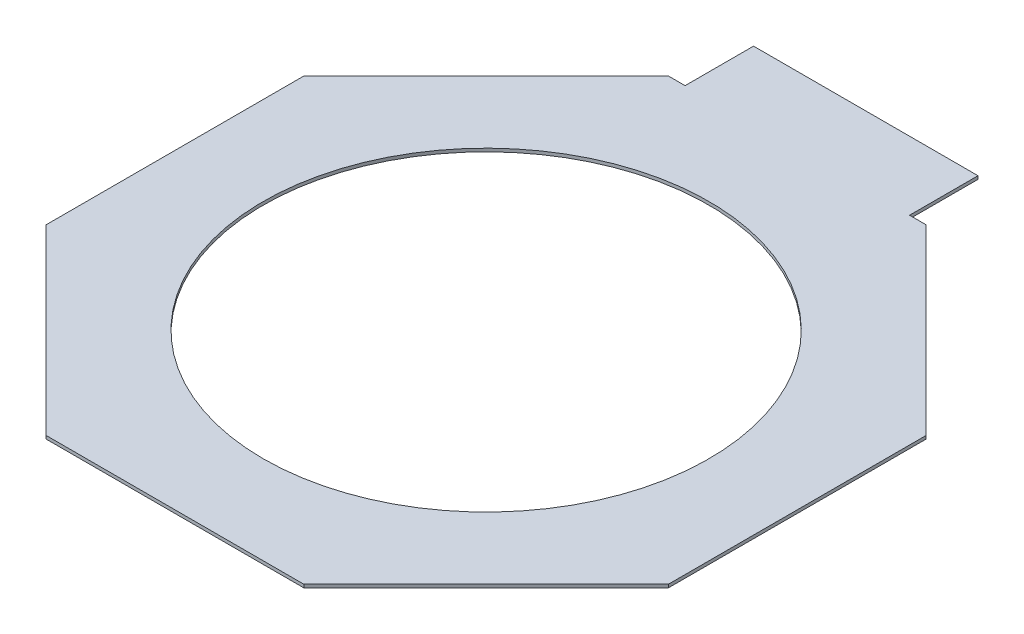
ISO-10303-21;
HEADER;
FILE_DESCRIPTION(('STEP AP214'),'2;1');
FILE_NAME('part.step','',(''),(''),'','','');
FILE_SCHEMA(('AUTOMOTIVE_DESIGN { 1 0 10303 214 1 1 1 1 }'));
ENDSEC;
DATA;
#1=APPLICATION_CONTEXT('core data for automotive mechanical design processes');
#2=APPLICATION_PROTOCOL_DEFINITION('international standard','automotive_design',2000,#1);
#3=PRODUCT_CONTEXT('',#1,'mechanical');
#4=PRODUCT('Part','Part','',(#3));
#5=PRODUCT_RELATED_PRODUCT_CATEGORY('part','',(#4));
#6=PRODUCT_DEFINITION_FORMATION('','',#4);
#7=PRODUCT_DEFINITION_CONTEXT('part definition',#1,'design');
#8=PRODUCT_DEFINITION('design','',#6,#7);
#9=PRODUCT_DEFINITION_SHAPE('','',#8);
#10=(LENGTH_UNIT() NAMED_UNIT(*) SI_UNIT(.MILLI.,.METRE.));
#11=(NAMED_UNIT(*) PLANE_ANGLE_UNIT() SI_UNIT($,.RADIAN.));
#12=(NAMED_UNIT(*) SI_UNIT($,.STERADIAN.) SOLID_ANGLE_UNIT());
#13=UNCERTAINTY_MEASURE_WITH_UNIT(LENGTH_MEASURE(1.E-05),#10,'distance_accuracy_value','');
#14=(GEOMETRIC_REPRESENTATION_CONTEXT(3) GLOBAL_UNCERTAINTY_ASSIGNED_CONTEXT((#13)) GLOBAL_UNIT_ASSIGNED_CONTEXT((#10,
#11,#12)) REPRESENTATION_CONTEXT('',''));
#15=CARTESIAN_POINT('',(0.,0.,0.));
#16=DIRECTION('',(0.,0.,1.));
#17=DIRECTION('',(1.,0.,0.));
#18=AXIS2_PLACEMENT_3D('',#15,#16,#17);
#19=CARTESIAN_POINT('',(0.,0.1,0.));
#20=DIRECTION('',(0.,1.,0.));
#21=DIRECTION('',(0.,0.,1.));
#22=AXIS2_PLACEMENT_3D('',#19,#20,#21);
#23=PLANE('',#22);
#24=DIRECTION('',(-0.707106781186547,0.,-0.707106781186547));
#25=VECTOR('',#24,1.);
#26=CARTESIAN_POINT('',(19.55,0.1,-8.097875144394));
#27=LINE('',#26,#25);
#28=CARTESIAN_POINT('',(19.55,0.1,-8.097875144394));
#29=VERTEX_POINT('',#28);
#30=CARTESIAN_POINT('',(8.09787514439401,0.1,-19.55));
#31=VERTEX_POINT('',#30);
#32=EDGE_CURVE('E180',#29,#31,#27,.T.);
#33=ORIENTED_EDGE('',*,*,#32,.T.);
#34=DIRECTION('',(-1.,0.,0.));
#35=VECTOR('',#34,1.);
#36=CARTESIAN_POINT('',(8.09787514439401,0.1,-19.55));
#37=LINE('',#36,#35);
#38=CARTESIAN_POINT('',(7.05,0.1,-19.55));
#39=VERTEX_POINT('',#38);
#40=EDGE_CURVE('E108',#31,#39,#37,.T.);
#41=ORIENTED_EDGE('',*,*,#40,.T.);
#42=DIRECTION('',(0.,0.,-1.));
#43=VECTOR('',#42,1.);
#44=CARTESIAN_POINT('',(7.05,0.1,-19.55));
#45=LINE('',#44,#43);
#46=CARTESIAN_POINT('',(7.05,0.1,-23.85));
#47=VERTEX_POINT('',#46);
#48=EDGE_CURVE('E207',#39,#47,#45,.T.);
#49=ORIENTED_EDGE('',*,*,#48,.T.);
#50=DIRECTION('',(-1.,0.,0.));
#51=VECTOR('',#50,1.);
#52=CARTESIAN_POINT('',(-7.05,0.1,-23.85));
#53=LINE('',#52,#51);
#54=CARTESIAN_POINT('',(-7.05,0.1,-23.85));
#55=VERTEX_POINT('',#54);
#56=EDGE_CURVE('E226',#47,#55,#53,.T.);
#57=ORIENTED_EDGE('',*,*,#56,.T.);
#58=DIRECTION('',(0.,0.,1.));
#59=VECTOR('',#58,1.);
#60=CARTESIAN_POINT('',(-7.05,0.1,-19.55));
#61=LINE('',#60,#59);
#62=CARTESIAN_POINT('',(-7.05,0.1,-19.55));
#63=VERTEX_POINT('',#62);
#64=EDGE_CURVE('E223',#55,#63,#61,.T.);
#65=ORIENTED_EDGE('',*,*,#64,.T.);
#66=DIRECTION('',(-1.,0.,0.));
#67=VECTOR('',#66,1.);
#68=CARTESIAN_POINT('',(-7.05,0.1,-19.55));
#69=LINE('',#68,#67);
#70=CARTESIAN_POINT('',(-8.09787514439401,0.1,-19.55));
#71=VERTEX_POINT('',#70);
#72=EDGE_CURVE('E225',#63,#71,#69,.T.);
#73=ORIENTED_EDGE('',*,*,#72,.T.);
#74=DIRECTION('',(-0.707106781186547,0.,0.707106781186548));
#75=VECTOR('',#74,1.);
#76=CARTESIAN_POINT('',(-8.09787514439401,0.1,-19.55));
#77=LINE('',#76,#75);
#78=CARTESIAN_POINT('',(-19.55,0.1,-8.097875144394));
#79=VERTEX_POINT('',#78);
#80=EDGE_CURVE('E228',#71,#79,#77,.T.);
#81=ORIENTED_EDGE('',*,*,#80,.T.);
#82=DIRECTION('',(0.,0.,1.));
#83=VECTOR('',#82,1.);
#84=CARTESIAN_POINT('',(-19.55,0.1,-8.097875144394));
#85=LINE('',#84,#83);
#86=CARTESIAN_POINT('',(-19.55,0.1,8.09787514439401));
#87=VERTEX_POINT('',#86);
#88=EDGE_CURVE('E234',#79,#87,#85,.T.);
#89=ORIENTED_EDGE('',*,*,#88,.T.);
#90=DIRECTION('',(0.707106781186548,0.,0.707106781186547));
#91=VECTOR('',#90,1.);
#92=CARTESIAN_POINT('',(-19.55,0.1,8.09787514439401));
#93=LINE('',#92,#91);
#94=CARTESIAN_POINT('',(-8.09787514439399,0.1,19.55));
#95=VERTEX_POINT('',#94);
#96=EDGE_CURVE('E139',#87,#95,#93,.T.);
#97=ORIENTED_EDGE('',*,*,#96,.T.);
#98=DIRECTION('',(1.,0.,0.));
#99=VECTOR('',#98,1.);
#100=CARTESIAN_POINT('',(-8.09787514439399,0.1,19.55));
#101=LINE('',#100,#99);
#102=CARTESIAN_POINT('',(8.09787514439401,0.1,19.55));
#103=VERTEX_POINT('',#102);
#104=EDGE_CURVE('E133',#95,#103,#101,.T.);
#105=ORIENTED_EDGE('',*,*,#104,.T.);
#106=DIRECTION('',(0.707106781186548,0.,-0.707106781186548));
#107=VECTOR('',#106,1.);
#108=CARTESIAN_POINT('',(8.09787514439401,0.1,19.55));
#109=LINE('',#108,#107);
#110=CARTESIAN_POINT('',(19.55,0.1,8.09787514439402));
#111=VERTEX_POINT('',#110);
#112=EDGE_CURVE('E137',#103,#111,#109,.T.);
#113=ORIENTED_EDGE('',*,*,#112,.T.);
#114=DIRECTION('',(0.,0.,-1.));
#115=VECTOR('',#114,1.);
#116=CARTESIAN_POINT('',(19.55,0.1,8.09787514439402));
#117=LINE('',#116,#115);
#118=EDGE_CURVE('E53',#111,#29,#117,.T.);
#119=ORIENTED_EDGE('',*,*,#118,.T.);
#120=EDGE_LOOP('',(#33,#41,#49,#57,#65,#73,#81,#89,#97,#105,#113,#119));
#121=FACE_BOUND('',#120,.T.);
#122=CARTESIAN_POINT('',(0.,0.1,0.));
#123=DIRECTION('',(0.,1.,0.));
#124=DIRECTION('',(0.,0.,1.));
#125=AXIS2_PLACEMENT_3D('',#122,#123,#124);
#126=CIRCLE('',#125,14.);
#127=CARTESIAN_POINT('',(0.,0.1,14.));
#128=VERTEX_POINT('',#127);
#129=EDGE_CURVE('E161',#128,#128,#126,.T.);
#130=ORIENTED_EDGE('',*,*,#129,.F.);
#131=EDGE_LOOP('',(#130));
#132=FACE_BOUND('',#131,.T.);
#133=ADVANCED_FACE('F36',(#121,#132),#23,.T.);
#134=CARTESIAN_POINT('',(0.,-0.1,0.));
#135=DIRECTION('',(0.,1.,0.));
#136=DIRECTION('',(0.,0.,1.));
#137=AXIS2_PLACEMENT_3D('',#134,#135,#136);
#138=PLANE('',#137);
#139=DIRECTION('',(-0.707106781186547,0.,-0.707106781186547));
#140=VECTOR('',#139,1.);
#141=CARTESIAN_POINT('',(19.55,-0.1,-8.097875144394));
#142=LINE('',#141,#140);
#143=CARTESIAN_POINT('',(19.55,-0.1,-8.097875144394));
#144=VERTEX_POINT('',#143);
#145=CARTESIAN_POINT('',(8.09787514439401,-0.1,-19.55));
#146=VERTEX_POINT('',#145);
#147=EDGE_CURVE('E157',#144,#146,#142,.T.);
#148=ORIENTED_EDGE('',*,*,#147,.F.);
#149=DIRECTION('',(0.,0.,-1.));
#150=VECTOR('',#149,1.);
#151=CARTESIAN_POINT('',(19.55,-0.1,8.09787514439402));
#152=LINE('',#151,#150);
#153=CARTESIAN_POINT('',(19.55,-0.1,8.09787514439402));
#154=VERTEX_POINT('',#153);
#155=EDGE_CURVE('E100',#154,#144,#152,.T.);
#156=ORIENTED_EDGE('',*,*,#155,.F.);
#157=DIRECTION('',(0.707106781186548,0.,-0.707106781186548));
#158=VECTOR('',#157,1.);
#159=CARTESIAN_POINT('',(8.09787514439401,-0.1,19.55));
#160=LINE('',#159,#158);
#161=CARTESIAN_POINT('',(8.09787514439401,-0.1,19.55));
#162=VERTEX_POINT('',#161);
#163=EDGE_CURVE('E94',#162,#154,#160,.T.);
#164=ORIENTED_EDGE('',*,*,#163,.F.);
#165=DIRECTION('',(1.,0.,0.));
#166=VECTOR('',#165,1.);
#167=CARTESIAN_POINT('',(-8.09787514439399,-0.1,19.55));
#168=LINE('',#167,#166);
#169=CARTESIAN_POINT('',(-8.09787514439399,-0.1,19.55));
#170=VERTEX_POINT('',#169);
#171=EDGE_CURVE('E147',#170,#162,#168,.T.);
#172=ORIENTED_EDGE('',*,*,#171,.F.);
#173=DIRECTION('',(0.707106781186548,0.,0.707106781186547));
#174=VECTOR('',#173,1.);
#175=CARTESIAN_POINT('',(-19.55,-0.1,8.09787514439401));
#176=LINE('',#175,#174);
#177=CARTESIAN_POINT('',(-19.55,-0.1,8.09787514439401));
#178=VERTEX_POINT('',#177);
#179=EDGE_CURVE('E175',#178,#170,#176,.T.);
#180=ORIENTED_EDGE('',*,*,#179,.F.);
#181=DIRECTION('',(0.,0.,1.));
#182=VECTOR('',#181,1.);
#183=CARTESIAN_POINT('',(-19.55,-0.1,-8.097875144394));
#184=LINE('',#183,#182);
#185=CARTESIAN_POINT('',(-19.55,-0.1,-8.097875144394));
#186=VERTEX_POINT('',#185);
#187=EDGE_CURVE('E173',#186,#178,#184,.T.);
#188=ORIENTED_EDGE('',*,*,#187,.F.);
#189=DIRECTION('',(-0.707106781186547,0.,0.707106781186548));
#190=VECTOR('',#189,1.);
#191=CARTESIAN_POINT('',(-8.09787514439401,-0.1,-19.55));
#192=LINE('',#191,#190);
#193=CARTESIAN_POINT('',(-8.09787514439401,-0.1,-19.55));
#194=VERTEX_POINT('',#193);
#195=EDGE_CURVE('E171',#194,#186,#192,.T.);
#196=ORIENTED_EDGE('',*,*,#195,.F.);
#197=DIRECTION('',(-1.,0.,0.));
#198=VECTOR('',#197,1.);
#199=CARTESIAN_POINT('',(-7.05,-0.1,-19.55));
#200=LINE('',#199,#198);
#201=CARTESIAN_POINT('',(-7.05,-0.1,-19.55));
#202=VERTEX_POINT('',#201);
#203=EDGE_CURVE('E169',#202,#194,#200,.T.);
#204=ORIENTED_EDGE('',*,*,#203,.F.);
#205=DIRECTION('',(0.,0.,1.));
#206=VECTOR('',#205,1.);
#207=CARTESIAN_POINT('',(-7.05,-0.1,-19.55));
#208=LINE('',#207,#206);
#209=CARTESIAN_POINT('',(-7.05,-0.1,-23.85));
#210=VERTEX_POINT('',#209);
#211=EDGE_CURVE('E167',#210,#202,#208,.T.);
#212=ORIENTED_EDGE('',*,*,#211,.F.);
#213=DIRECTION('',(-1.,0.,0.));
#214=VECTOR('',#213,1.);
#215=CARTESIAN_POINT('',(-7.05,-0.1,-23.85));
#216=LINE('',#215,#214);
#217=CARTESIAN_POINT('',(7.05,-0.1,-23.85));
#218=VERTEX_POINT('',#217);
#219=EDGE_CURVE('E165',#218,#210,#216,.T.);
#220=ORIENTED_EDGE('',*,*,#219,.F.);
#221=DIRECTION('',(0.,0.,-1.));
#222=VECTOR('',#221,1.);
#223=CARTESIAN_POINT('',(7.05,-0.1,-19.55));
#224=LINE('',#223,#222);
#225=CARTESIAN_POINT('',(7.05,-0.1,-19.55));
#226=VERTEX_POINT('',#225);
#227=EDGE_CURVE('E163',#226,#218,#224,.T.);
#228=ORIENTED_EDGE('',*,*,#227,.F.);
#229=DIRECTION('',(-1.,0.,0.));
#230=VECTOR('',#229,1.);
#231=CARTESIAN_POINT('',(8.09787514439401,-0.1,-19.55));
#232=LINE('',#231,#230);
#233=EDGE_CURVE('E160',#146,#226,#232,.T.);
#234=ORIENTED_EDGE('',*,*,#233,.F.);
#235=EDGE_LOOP('',(#148,#156,#164,#172,#180,#188,#196,#204,#212,#220,#228,#234));
#236=FACE_BOUND('',#235,.T.);
#237=CARTESIAN_POINT('',(0.,-0.1,0.));
#238=DIRECTION('',(0.,1.,0.));
#239=DIRECTION('',(0.,0.,1.));
#240=AXIS2_PLACEMENT_3D('',#237,#238,#239);
#241=CIRCLE('',#240,14.);
#242=CARTESIAN_POINT('',(0.,-0.1,14.));
#243=VERTEX_POINT('',#242);
#244=EDGE_CURVE('E381',#243,#243,#241,.T.);
#245=ORIENTED_EDGE('',*,*,#244,.T.);
#246=EDGE_LOOP('',(#245));
#247=FACE_BOUND('',#246,.T.);
#248=ADVANCED_FACE('F211',(#236,#247),#138,.F.);
#249=CARTESIAN_POINT('',(19.55,0.1,-8.097875144394));
#250=DIRECTION('',(-0.707106781186548,0.,0.707106781186548));
#251=DIRECTION('',(0.707106781186548,0.,0.707106781186548));
#252=AXIS2_PLACEMENT_3D('',#249,#250,#251);
#253=PLANE('',#252);
#254=ORIENTED_EDGE('',*,*,#147,.T.);
#255=DIRECTION('',(0.,-1.,0.));
#256=VECTOR('',#255,1.);
#257=CARTESIAN_POINT('',(8.09787514439401,0.1,-19.55));
#258=LINE('',#257,#256);
#259=EDGE_CURVE('E11',#31,#146,#258,.T.);
#260=ORIENTED_EDGE('',*,*,#259,.F.);
#261=ORIENTED_EDGE('',*,*,#32,.F.);
#262=DIRECTION('',(0.,-1.,0.));
#263=VECTOR('',#262,1.);
#264=CARTESIAN_POINT('',(19.55,0.1,-8.097875144394));
#265=LINE('',#264,#263);
#266=EDGE_CURVE('E153',#29,#144,#265,.T.);
#267=ORIENTED_EDGE('',*,*,#266,.T.);
#268=EDGE_LOOP('',(#254,#260,#261,#267));
#269=FACE_BOUND('',#268,.T.);
#270=ADVANCED_FACE('F38',(#269),#253,.F.);
#271=CARTESIAN_POINT('',(8.09787514439401,0.1,-19.55));
#272=DIRECTION('',(0.,0.,1.));
#273=DIRECTION('',(1.,0.,0.));
#274=AXIS2_PLACEMENT_3D('',#271,#272,#273);
#275=PLANE('',#274);
#276=ORIENTED_EDGE('',*,*,#233,.T.);
#277=DIRECTION('',(0.,-1.,0.));
#278=VECTOR('',#277,1.);
#279=CARTESIAN_POINT('',(7.05,0.1,-19.55));
#280=LINE('',#279,#278);
#281=EDGE_CURVE('E45',#39,#226,#280,.T.);
#282=ORIENTED_EDGE('',*,*,#281,.F.);
#283=ORIENTED_EDGE('',*,*,#40,.F.);
#284=ORIENTED_EDGE('',*,*,#259,.T.);
#285=EDGE_LOOP('',(#276,#282,#283,#284));
#286=FACE_BOUND('',#285,.T.);
#287=ADVANCED_FACE('F268',(#286),#275,.F.);
#288=CARTESIAN_POINT('',(7.05,0.1,-19.55));
#289=DIRECTION('',(-1.,0.,0.));
#290=DIRECTION('',(0.,0.,1.));
#291=AXIS2_PLACEMENT_3D('',#288,#289,#290);
#292=PLANE('',#291);
#293=ORIENTED_EDGE('',*,*,#227,.T.);
#294=DIRECTION('',(0.,-1.,0.));
#295=VECTOR('',#294,1.);
#296=CARTESIAN_POINT('',(7.05,0.1,-23.85));
#297=LINE('',#296,#295);
#298=EDGE_CURVE('E199',#47,#218,#297,.T.);
#299=ORIENTED_EDGE('',*,*,#298,.F.);
#300=ORIENTED_EDGE('',*,*,#48,.F.);
#301=ORIENTED_EDGE('',*,*,#281,.T.);
#302=EDGE_LOOP('',(#293,#299,#300,#301));
#303=FACE_BOUND('',#302,.T.);
#304=ADVANCED_FACE('F205',(#303),#292,.F.);
#305=CARTESIAN_POINT('',(-7.05,0.1,-23.85));
#306=DIRECTION('',(0.,0.,1.));
#307=DIRECTION('',(1.,0.,0.));
#308=AXIS2_PLACEMENT_3D('',#305,#306,#307);
#309=PLANE('',#308);
#310=ORIENTED_EDGE('',*,*,#219,.T.);
#311=DIRECTION('',(0.,-1.,0.));
#312=VECTOR('',#311,1.);
#313=CARTESIAN_POINT('',(-7.05,0.1,-23.85));
#314=LINE('',#313,#312);
#315=EDGE_CURVE('E196',#55,#210,#314,.T.);
#316=ORIENTED_EDGE('',*,*,#315,.F.);
#317=ORIENTED_EDGE('',*,*,#56,.F.);
#318=ORIENTED_EDGE('',*,*,#298,.T.);
#319=EDGE_LOOP('',(#310,#316,#317,#318));
#320=FACE_BOUND('',#319,.T.);
#321=ADVANCED_FACE('F217',(#320),#309,.F.);
#322=CARTESIAN_POINT('',(-7.05,0.1,-19.55));
#323=DIRECTION('',(1.,0.,0.));
#324=DIRECTION('',(0.,0.,-1.));
#325=AXIS2_PLACEMENT_3D('',#322,#323,#324);
#326=PLANE('',#325);
#327=ORIENTED_EDGE('',*,*,#211,.T.);
#328=DIRECTION('',(0.,-1.,0.));
#329=VECTOR('',#328,1.);
#330=CARTESIAN_POINT('',(-7.05,0.1,-19.55));
#331=LINE('',#330,#329);
#332=EDGE_CURVE('E193',#63,#202,#331,.T.);
#333=ORIENTED_EDGE('',*,*,#332,.F.);
#334=ORIENTED_EDGE('',*,*,#64,.F.);
#335=ORIENTED_EDGE('',*,*,#315,.T.);
#336=EDGE_LOOP('',(#327,#333,#334,#335));
#337=FACE_BOUND('',#336,.T.);
#338=ADVANCED_FACE('F221',(#337),#326,.F.);
#339=CARTESIAN_POINT('',(-7.05,0.1,-19.55));
#340=DIRECTION('',(0.,0.,1.));
#341=DIRECTION('',(1.,0.,0.));
#342=AXIS2_PLACEMENT_3D('',#339,#340,#341);
#343=PLANE('',#342);
#344=ORIENTED_EDGE('',*,*,#203,.T.);
#345=DIRECTION('',(0.,-1.,0.));
#346=VECTOR('',#345,1.);
#347=CARTESIAN_POINT('',(-8.09787514439401,0.1,-19.55));
#348=LINE('',#347,#346);
#349=EDGE_CURVE('E190',#71,#194,#348,.T.);
#350=ORIENTED_EDGE('',*,*,#349,.F.);
#351=ORIENTED_EDGE('',*,*,#72,.F.);
#352=ORIENTED_EDGE('',*,*,#332,.T.);
#353=EDGE_LOOP('',(#344,#350,#351,#352));
#354=FACE_BOUND('',#353,.T.);
#355=ADVANCED_FACE('F281',(#354),#343,.F.);
#356=CARTESIAN_POINT('',(-8.09787514439401,0.1,-19.55));
#357=DIRECTION('',(0.707106781186548,0.,0.707106781186547));
#358=DIRECTION('',(0.707106781186547,0.,-0.707106781186548));
#359=AXIS2_PLACEMENT_3D('',#356,#357,#358);
#360=PLANE('',#359);
#361=ORIENTED_EDGE('',*,*,#195,.T.);
#362=DIRECTION('',(0.,-1.,0.));
#363=VECTOR('',#362,1.);
#364=CARTESIAN_POINT('',(-19.55,0.1,-8.097875144394));
#365=LINE('',#364,#363);
#366=EDGE_CURVE('E187',#79,#186,#365,.T.);
#367=ORIENTED_EDGE('',*,*,#366,.F.);
#368=ORIENTED_EDGE('',*,*,#80,.F.);
#369=ORIENTED_EDGE('',*,*,#349,.T.);
#370=EDGE_LOOP('',(#361,#367,#368,#369));
#371=FACE_BOUND('',#370,.T.);
#372=ADVANCED_FACE('F284',(#371),#360,.F.);
#373=CARTESIAN_POINT('',(-19.55,0.1,-8.097875144394));
#374=DIRECTION('',(1.,0.,0.));
#375=DIRECTION('',(0.,0.,-1.));
#376=AXIS2_PLACEMENT_3D('',#373,#374,#375);
#377=PLANE('',#376);
#378=ORIENTED_EDGE('',*,*,#187,.T.);
#379=DIRECTION('',(0.,-1.,0.));
#380=VECTOR('',#379,1.);
#381=CARTESIAN_POINT('',(-19.55,0.1,8.09787514439401));
#382=LINE('',#381,#380);
#383=EDGE_CURVE('E184',#87,#178,#382,.T.);
#384=ORIENTED_EDGE('',*,*,#383,.F.);
#385=ORIENTED_EDGE('',*,*,#88,.F.);
#386=ORIENTED_EDGE('',*,*,#366,.T.);
#387=EDGE_LOOP('',(#378,#384,#385,#386));
#388=FACE_BOUND('',#387,.T.);
#389=ADVANCED_FACE('F240',(#388),#377,.F.);
#390=CARTESIAN_POINT('',(-19.55,0.1,8.09787514439401));
#391=DIRECTION('',(0.707106781186547,0.,-0.707106781186548));
#392=DIRECTION('',(-0.707106781186548,0.,-0.707106781186547));
#393=AXIS2_PLACEMENT_3D('',#390,#391,#392);
#394=PLANE('',#393);
#395=ORIENTED_EDGE('',*,*,#179,.T.);
#396=DIRECTION('',(0.,-1.,0.));
#397=VECTOR('',#396,1.);
#398=CARTESIAN_POINT('',(-8.09787514439399,0.1,19.55));
#399=LINE('',#398,#397);
#400=EDGE_CURVE('E148',#95,#170,#399,.T.);
#401=ORIENTED_EDGE('',*,*,#400,.F.);
#402=ORIENTED_EDGE('',*,*,#96,.F.);
#403=ORIENTED_EDGE('',*,*,#383,.T.);
#404=EDGE_LOOP('',(#395,#401,#402,#403));
#405=FACE_BOUND('',#404,.T.);
#406=ADVANCED_FACE('F244',(#405),#394,.F.);
#407=CARTESIAN_POINT('',(-8.09787514439399,0.1,19.55));
#408=DIRECTION('',(0.,0.,-1.));
#409=DIRECTION('',(-1.,0.,0.));
#410=AXIS2_PLACEMENT_3D('',#407,#408,#409);
#411=PLANE('',#410);
#412=ORIENTED_EDGE('',*,*,#171,.T.);
#413=DIRECTION('',(0.,-1.,0.));
#414=VECTOR('',#413,1.);
#415=CARTESIAN_POINT('',(8.09787514439401,0.1,19.55));
#416=LINE('',#415,#414);
#417=EDGE_CURVE('E144',#103,#162,#416,.T.);
#418=ORIENTED_EDGE('',*,*,#417,.F.);
#419=ORIENTED_EDGE('',*,*,#104,.F.);
#420=ORIENTED_EDGE('',*,*,#400,.T.);
#421=EDGE_LOOP('',(#412,#418,#419,#420));
#422=FACE_BOUND('',#421,.T.);
#423=ADVANCED_FACE('F145',(#422),#411,.F.);
#424=CARTESIAN_POINT('',(8.09787514439401,0.1,19.55));
#425=DIRECTION('',(-0.707106781186548,0.,-0.707106781186548));
#426=DIRECTION('',(-0.707106781186547,0.,0.707106781186548));
#427=AXIS2_PLACEMENT_3D('',#424,#425,#426);
#428=PLANE('',#427);
#429=ORIENTED_EDGE('',*,*,#163,.T.);
#430=DIRECTION('',(0.,-1.,0.));
#431=VECTOR('',#430,1.);
#432=CARTESIAN_POINT('',(19.55,0.1,8.09787514439402));
#433=LINE('',#432,#431);
#434=EDGE_CURVE('E149',#111,#154,#433,.T.);
#435=ORIENTED_EDGE('',*,*,#434,.F.);
#436=ORIENTED_EDGE('',*,*,#112,.F.);
#437=ORIENTED_EDGE('',*,*,#417,.T.);
#438=EDGE_LOOP('',(#429,#435,#436,#437));
#439=FACE_BOUND('',#438,.T.);
#440=ADVANCED_FACE('F151',(#439),#428,.F.);
#441=CARTESIAN_POINT('',(19.55,0.1,8.09787514439402));
#442=DIRECTION('',(-1.,0.,0.));
#443=DIRECTION('',(0.,0.,1.));
#444=AXIS2_PLACEMENT_3D('',#441,#442,#443);
#445=PLANE('',#444);
#446=ORIENTED_EDGE('',*,*,#155,.T.);
#447=ORIENTED_EDGE('',*,*,#266,.F.);
#448=ORIENTED_EDGE('',*,*,#118,.F.);
#449=ORIENTED_EDGE('',*,*,#434,.T.);
#450=EDGE_LOOP('',(#446,#447,#448,#449));
#451=FACE_BOUND('',#450,.T.);
#452=ADVANCED_FACE('F248',(#451),#445,.F.);
#453=CARTESIAN_POINT('',(0.,0.1,0.));
#454=DIRECTION('',(0.,-1.,0.));
#455=DIRECTION('',(0.,0.,-1.));
#456=AXIS2_PLACEMENT_3D('',#453,#454,#455);
#457=CYLINDRICAL_SURFACE('',#456,14.);
#458=ORIENTED_EDGE('',*,*,#129,.T.);
#459=EDGE_LOOP('',(#458));
#460=FACE_BOUND('',#459,.T.);
#461=ORIENTED_EDGE('',*,*,#244,.F.);
#462=EDGE_LOOP('',(#461));
#463=FACE_BOUND('',#462,.T.);
#464=ADVANCED_FACE('F250',(#460,#463),#457,.F.);
#465=CLOSED_SHELL('',(#133,#248,#270,#287,#304,#321,#338,#355,#372,#389,#406,#423,#440,#452,#464));
#466=MANIFOLD_SOLID_BREP('B2',#465);
#467=ADVANCED_BREP_SHAPE_REPRESENTATION('',(#18,#466),#14);
#468=SHAPE_DEFINITION_REPRESENTATION(#9,#467);
ENDSEC;
END-ISO-10303-21;
